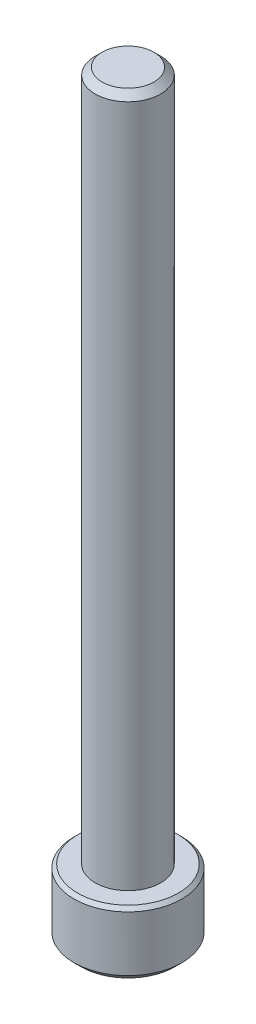
ISO-10303-21;
HEADER;
FILE_DESCRIPTION(('STEP AP214'),'2;1');
FILE_NAME('part.step','',(''),(''),'','','');
FILE_SCHEMA(('AUTOMOTIVE_DESIGN { 1 0 10303 214 1 1 1 1 }'));
ENDSEC;
DATA;
#1=APPLICATION_CONTEXT('core data for automotive mechanical design processes');
#2=APPLICATION_PROTOCOL_DEFINITION('international standard','automotive_design',2000,#1);
#3=PRODUCT_CONTEXT('',#1,'mechanical');
#4=PRODUCT('Part','Part','',(#3));
#5=PRODUCT_RELATED_PRODUCT_CATEGORY('part','',(#4));
#6=PRODUCT_DEFINITION_FORMATION('','',#4);
#7=PRODUCT_DEFINITION_CONTEXT('part definition',#1,'design');
#8=PRODUCT_DEFINITION('design','',#6,#7);
#9=PRODUCT_DEFINITION_SHAPE('','',#8);
#10=(LENGTH_UNIT() NAMED_UNIT(*) SI_UNIT(.MILLI.,.METRE.));
#11=(NAMED_UNIT(*) PLANE_ANGLE_UNIT() SI_UNIT($,.RADIAN.));
#12=(NAMED_UNIT(*) SI_UNIT($,.STERADIAN.) SOLID_ANGLE_UNIT());
#13=UNCERTAINTY_MEASURE_WITH_UNIT(LENGTH_MEASURE(1.E-05),#10,'distance_accuracy_value','');
#14=(GEOMETRIC_REPRESENTATION_CONTEXT(3) GLOBAL_UNCERTAINTY_ASSIGNED_CONTEXT((#13)) GLOBAL_UNIT_ASSIGNED_CONTEXT((#10,
#11,#12)) REPRESENTATION_CONTEXT('',''));
#15=CARTESIAN_POINT('',(0.,0.,0.));
#16=DIRECTION('',(0.,0.,1.));
#17=DIRECTION('',(1.,0.,0.));
#18=AXIS2_PLACEMENT_3D('',#15,#16,#17);
#19=CARTESIAN_POINT('',(0.,-1.8494248,0.));
#20=DIRECTION('',(0.,-1.,0.));
#21=DIRECTION('',(0.,0.,-1.));
#22=AXIS2_PLACEMENT_3D('',#19,#20,#21);
#23=PLANE('',#22);
#24=DIRECTION('',(-0.866025403784439,0.,0.5));
#25=VECTOR('',#24,1.);
#26=CARTESIAN_POINT('',(-1.984375,-1.8494248,-1.14567944042316));
#27=LINE('',#26,#25);
#28=CARTESIAN_POINT('',(-1.984375,-1.8494248,-1.14567944042316));
#29=VERTEX_POINT('',#28);
#30=CARTESIAN_POINT('',(0.,-1.8494248,-2.29135888084633));
#31=VERTEX_POINT('',#30);
#32=EDGE_CURVE('E85',#29,#31,#27,.F.);
#33=ORIENTED_EDGE('',*,*,#32,.T.);
#34=DIRECTION('',(-0.866025403784439,0.,-0.5));
#35=VECTOR('',#34,1.);
#36=CARTESIAN_POINT('',(0.,-1.8494248,-2.29135888084633));
#37=LINE('',#36,#35);
#38=CARTESIAN_POINT('',(1.984375,-1.8494248,-1.14567944042316));
#39=VERTEX_POINT('',#38);
#40=EDGE_CURVE('E86',#31,#39,#37,.F.);
#41=ORIENTED_EDGE('',*,*,#40,.T.);
#42=DIRECTION('',(0.,0.,-1.));
#43=VECTOR('',#42,1.);
#44=CARTESIAN_POINT('',(1.984375,-1.8494248,-1.14567944042316));
#45=LINE('',#44,#43);
#46=CARTESIAN_POINT('',(1.984375,-1.8494248,1.14567944042316));
#47=VERTEX_POINT('',#46);
#48=EDGE_CURVE('E72',#39,#47,#45,.F.);
#49=ORIENTED_EDGE('',*,*,#48,.T.);
#50=DIRECTION('',(0.866025403784438,0.,-0.500000000000001));
#51=VECTOR('',#50,1.);
#52=CARTESIAN_POINT('',(1.984375,-1.8494248,1.14567944042316));
#53=LINE('',#52,#51);
#54=CARTESIAN_POINT('',(0.,-1.8494248,2.29135888084633));
#55=VERTEX_POINT('',#54);
#56=EDGE_CURVE('E111',#47,#55,#53,.F.);
#57=ORIENTED_EDGE('',*,*,#56,.T.);
#58=DIRECTION('',(0.866025403784439,0.,0.5));
#59=VECTOR('',#58,1.);
#60=CARTESIAN_POINT('',(0.,-1.8494248,2.29135888084633));
#61=LINE('',#60,#59);
#62=CARTESIAN_POINT('',(-1.984375,-1.8494248,1.14567944042316));
#63=VERTEX_POINT('',#62);
#64=EDGE_CURVE('E116',#55,#63,#61,.F.);
#65=ORIENTED_EDGE('',*,*,#64,.T.);
#66=DIRECTION('',(0.,0.,1.));
#67=VECTOR('',#66,1.);
#68=CARTESIAN_POINT('',(-1.984375,-1.8494248,1.14567944042316));
#69=LINE('',#68,#67);
#70=EDGE_CURVE('E83',#63,#29,#69,.F.);
#71=ORIENTED_EDGE('',*,*,#70,.T.);
#72=EDGE_LOOP('',(#33,#41,#49,#57,#65,#71));
#73=FACE_BOUND('',#72,.T.);
#74=ADVANCED_FACE('F17',(#73),#23,.T.);
#75=CARTESIAN_POINT('',(0.,-1.8494248,-2.29135888084633));
#76=DIRECTION('',(0.5,0.,-0.866025403784439));
#77=DIRECTION('',(-0.866025403784439,0.,-0.5));
#78=AXIS2_PLACEMENT_3D('',#75,#76,#77);
#79=PLANE('',#78);
#80=CARTESIAN_POINT('',(6.77390980870158E-12,-4.82599999999733,-2.29135888084242));
#81=CARTESIAN_POINT('',(0.0682039378801892,-4.78666022797152,-2.25198131895141));
#82=CARTESIAN_POINT('',(0.137548246994805,-4.74963132848448,-2.21194536341732));
#83=CARTESIAN_POINT('',(0.278948409548869,-4.6818329942972,-2.13030794150327));
#84=CARTESIAN_POINT('',(0.351017702803339,-4.65110127024125,-2.0886987156425));
#85=CARTESIAN_POINT('',(0.496341897584324,-4.59845762015676,-2.00479575266593));
#86=CARTESIAN_POINT('',(0.569559809368178,-4.57641341201181,-1.96252337158802));
#87=CARTESIAN_POINT('',(0.717607077473199,-4.54245011072935,-1.8770482414948));
#88=CARTESIAN_POINT('',(0.7924319144146,-4.53050567477546,-1.83384810174461));
#89=CARTESIAN_POINT('',(0.921395967955599,-4.51972842758016,-1.75939067071693));
#90=CARTESIAN_POINT('',(0.975368691596877,-4.51813352800511,-1.72822950419374));
#91=CARTESIAN_POINT('',(1.08322583079261,-4.52082392144325,-1.66595815584506));
#92=CARTESIAN_POINT('',(1.1371102087676,-4.52511127551635,-1.63484799571608));
#93=CARTESIAN_POINT('',(1.24437007981747,-4.53932219427335,-1.57292148029219));
#94=CARTESIAN_POINT('',(1.29774493597746,-4.54925206051542,-1.54210549272027));
#95=CARTESIAN_POINT('',(1.40357163687848,-4.57420294850528,-1.48100641846761));
#96=CARTESIAN_POINT('',(1.4560235520826,-4.58922357980262,-1.450723291105));
#97=CARTESIAN_POINT('',(1.5903440841042,-4.63380478906143,-1.37317329578464));
#98=CARTESIAN_POINT('',(1.67138069095165,-4.66672213389562,-1.32638678900705));
#99=CARTESIAN_POINT('',(1.79053879220806,-4.72228952043972,-1.25759082717053));
#100=CARTESIAN_POINT('',(1.82980683299605,-4.74181309380753,-1.23491941325104));
#101=CARTESIAN_POINT('',(1.90761582760645,-4.78263970070438,-1.18999636926735));
#102=CARTESIAN_POINT('',(1.94615720952052,-4.80394164367431,-1.16774449204432));
#103=CARTESIAN_POINT('',(1.98437499999323,-4.82599999999733,-1.14567944042707));
#104=B_SPLINE_CURVE_WITH_KNOTS('',3,(#80,#81,#82,#83,#84,#85,#86,#87,#88,#89,#90,#91,#92,#93,
#94,#95,#96,#97,#98,#99,#100,#101,#102,#103),.UNSPECIFIED.,.F.,.F.,(4,2,2,2,2,2,2,2,2,2,2,4),
(0.,0.264284909619185,0.530108996343387,0.791712695392495,1.05265800171552,1.23942150113838,
1.42625045660981,1.61328847391305,1.80031214905772,2.09727151177706,2.24534838939838,
2.39333511883578),.UNSPECIFIED.);
#105=CARTESIAN_POINT('',(0.,-4.82599999999063,-2.29135888083571));
#106=VERTEX_POINT('',#105);
#107=CARTESIAN_POINT('',(1.98437499999661,-4.82599999998867,-1.14567944040389));
#108=VERTEX_POINT('',#107);
#109=EDGE_CURVE('E20',#106,#108,#104,.T.);
#110=ORIENTED_EDGE('',*,*,#109,.T.);
#111=DIRECTION('',(0.,1.,0.));
#112=VECTOR('',#111,1.);
#113=CARTESIAN_POINT('',(1.984375,-1.8494248,-1.14567944042316));
#114=LINE('',#113,#112);
#115=EDGE_CURVE('E91',#108,#39,#114,.T.);
#116=ORIENTED_EDGE('',*,*,#115,.T.);
#117=ORIENTED_EDGE('',*,*,#40,.F.);
#118=DIRECTION('',(0.,1.,0.));
#119=VECTOR('',#118,1.);
#120=CARTESIAN_POINT('',(0.,-1.8494248,-2.29135888084633));
#121=LINE('',#120,#119);
#122=EDGE_CURVE('E59',#31,#106,#121,.F.);
#123=ORIENTED_EDGE('',*,*,#122,.T.);
#124=EDGE_LOOP('',(#110,#116,#117,#123));
#125=FACE_BOUND('',#124,.T.);
#126=ADVANCED_FACE('F90',(#125),#79,.F.);
#127=CARTESIAN_POINT('',(-1.984375,-1.8494248,-1.14567944042316));
#128=DIRECTION('',(-0.5,0.,-0.866025403784439));
#129=DIRECTION('',(-0.866025403784439,0.,0.5));
#130=AXIS2_PLACEMENT_3D('',#127,#128,#129);
#131=PLANE('',#130);
#132=CARTESIAN_POINT('',(-1.98437499999323,-4.82599999999733,-1.14567944042707));
#133=CARTESIAN_POINT('',(-1.91617106211981,-4.78666022797152,-1.18505700231808));
#134=CARTESIAN_POINT('',(-1.84682675300519,-4.74963132848448,-1.22509295785218));
#135=CARTESIAN_POINT('',(-1.70542659045113,-4.6818329942972,-1.30673037976622));
#136=CARTESIAN_POINT('',(-1.63335729719666,-4.65110127024125,-1.348339605627));
#137=CARTESIAN_POINT('',(-1.48803310241568,-4.59845762015676,-1.43224256860356));
#138=CARTESIAN_POINT('',(-1.41481519063182,-4.57641341201181,-1.47451494968147));
#139=CARTESIAN_POINT('',(-1.2667679225268,-4.54245011072935,-1.5599900797747));
#140=CARTESIAN_POINT('',(-1.1919430855854,-4.53050567477546,-1.60319021952488));
#141=CARTESIAN_POINT('',(-1.0629790320444,-4.51972842758016,-1.67764765055256));
#142=CARTESIAN_POINT('',(-1.00900630840312,-4.51813352800511,-1.70880881707575));
#143=CARTESIAN_POINT('',(-0.90114916920739,-4.52082392144325,-1.77108016542443));
#144=CARTESIAN_POINT('',(-0.847264791232404,-4.52511127551635,-1.80219032555341));
#145=CARTESIAN_POINT('',(-0.74000492018253,-4.53932219427335,-1.8641168409773));
#146=CARTESIAN_POINT('',(-0.686630064022541,-4.54925206051542,-1.89493282854922));
#147=CARTESIAN_POINT('',(-0.580803363121521,-4.57420294850528,-1.95603190280188));
#148=CARTESIAN_POINT('',(-0.528351447917403,-4.58922357980262,-1.98631503016449));
#149=CARTESIAN_POINT('',(-0.394030915895799,-4.63380478906143,-2.06386502548485));
#150=CARTESIAN_POINT('',(-0.312994309048352,-4.66672213389562,-2.11065153226244));
#151=CARTESIAN_POINT('',(-0.193836207791939,-4.72228952043972,-2.17944749409896));
#152=CARTESIAN_POINT('',(-0.15456816700395,-4.74181309380753,-2.20211890801845));
#153=CARTESIAN_POINT('',(-0.0767591723935507,-4.78263970070438,-2.24704195200214));
#154=CARTESIAN_POINT('',(-0.0382177904794774,-4.80394164367431,-2.26929382922517));
#155=CARTESIAN_POINT('',(-6.77500264921437E-12,-4.82599999999733,-2.29135888084242));
#156=B_SPLINE_CURVE_WITH_KNOTS('',3,(#132,#133,#134,#135,#136,#137,#138,#139,#140,#141,#142,
#143,#144,#145,#146,#147,#148,#149,#150,#151,#152,#153,#154,#155),.UNSPECIFIED.,.F.,.F.,(4,2,2,
2,2,2,2,2,2,2,2,4),(0.,0.264284909619185,0.530108996343387,0.791712695392495,1.05265800171552,
1.23942150113838,1.42625045660981,1.61328847391305,1.80031214905772,2.09727151177706,
2.24534838939838,2.39333511883578),.UNSPECIFIED.);
#157=CARTESIAN_POINT('',(-1.98437499999081,-4.82599999999063,-1.14567944041786));
#158=VERTEX_POINT('',#157);
#159=EDGE_CURVE('E95',#158,#106,#156,.T.);
#160=ORIENTED_EDGE('',*,*,#159,.T.);
#161=ORIENTED_EDGE('',*,*,#122,.F.);
#162=ORIENTED_EDGE('',*,*,#32,.F.);
#163=DIRECTION('',(0.,1.,0.));
#164=VECTOR('',#163,1.);
#165=CARTESIAN_POINT('',(-1.984375,-1.8494248,-1.14567944042316));
#166=LINE('',#165,#164);
#167=EDGE_CURVE('E97',#29,#158,#166,.F.);
#168=ORIENTED_EDGE('',*,*,#167,.T.);
#169=EDGE_LOOP('',(#160,#161,#162,#168));
#170=FACE_BOUND('',#169,.T.);
#171=ADVANCED_FACE('F93',(#170),#131,.F.);
#172=CARTESIAN_POINT('',(-1.984375,-1.8494248,1.14567944042316));
#173=DIRECTION('',(-1.,0.,0.));
#174=DIRECTION('',(0.,0.,1.));
#175=AXIS2_PLACEMENT_3D('',#172,#173,#174);
#176=PLANE('',#175);
#177=CARTESIAN_POINT('',(-1.984375,-4.82599999999733,1.14567944041534));
#178=CARTESIAN_POINT('',(-1.984375,-4.78666022797249,1.06692431662081));
#179=CARTESIAN_POINT('',(-1.984375,-4.74963132848694,0.986852405540027));
#180=CARTESIAN_POINT('',(-1.984375,-4.68183299430402,0.823577561686758));
#181=CARTESIAN_POINT('',(-1.984375,-4.65110127025095,0.740359109952628));
#182=CARTESIAN_POINT('',(-1.984375,-4.59845762017392,0.572553183974996));
#183=CARTESIAN_POINT('',(-1.984375,-4.5764134120335,0.488008421807264));
#184=CARTESIAN_POINT('',(-1.984375,-4.54245011076168,0.317058161597606));
#185=CARTESIAN_POINT('',(-1.984375,-4.53050567481389,0.230657882085925));
#186=CARTESIAN_POINT('',(-1.984375,-4.51972842762944,0.0817430200043619));
#187=CARTESIAN_POINT('',(-1.984375,-4.51813352805958,0.0194206869428192));
#188=CARTESIAN_POINT('',(-1.984375,-4.52082392150979,-0.105122009784304));
#189=CARTESIAN_POINT('',(-1.984375,-4.52511127558976,-0.167342330056852));
#190=CARTESIAN_POINT('',(-1.984375,-4.53932219436172,-0.291195360933165));
#191=CARTESIAN_POINT('',(-1.984375,-4.54925206061188,-0.352827336090956));
#192=CARTESIAN_POINT('',(-1.984375,-4.57420294861864,-0.475025484623506));
#193=CARTESIAN_POINT('',(-1.984375,-4.58922357992478,-0.535591739362032));
#194=CARTESIAN_POINT('',(-1.984375,-4.63380478918439,-0.690691729958718));
#195=CARTESIAN_POINT('',(-1.984375,-4.66672213400171,-0.784264743458756));
#196=CARTESIAN_POINT('',(-1.984375,-4.72228952051173,-0.92185666705287));
#197=CARTESIAN_POINT('',(-1.984375,-4.74181309386669,-0.967199494866103));
#198=CARTESIAN_POINT('',(-1.984375,-4.78263970073555,-1.05704558278325));
#199=CARTESIAN_POINT('',(-1.984375,-4.80394164369034,-1.10154933720483));
#200=CARTESIAN_POINT('',(-1.984375,-4.82599999999733,-1.14567944041534));
#201=B_SPLINE_CURVE_WITH_KNOTS('',3,(#177,#178,#179,#180,#181,#182,#183,#184,#185,#186,#187,
#188,#189,#190,#191,#192,#193,#194,#195,#196,#197,#198,#199,#200),.UNSPECIFIED.,.F.,.F.,(4,2,2,
2,2,2,2,2,2,2,2,4),(0.,0.264284909651518,0.530108996408062,0.791712695488213,1.05265800184225,
1.23942150131009,1.42625045682656,1.6132884741749,1.80031214936466,2.09727151191273,
2.24534838944787,2.39333511879948),.UNSPECIFIED.);
#202=CARTESIAN_POINT('',(-1.98437499999081,-4.82599999999063,1.14567944041786));
#203=VERTEX_POINT('',#202);
#204=EDGE_CURVE('E199',#203,#158,#201,.T.);
#205=ORIENTED_EDGE('',*,*,#204,.T.);
#206=ORIENTED_EDGE('',*,*,#167,.F.);
#207=ORIENTED_EDGE('',*,*,#70,.F.);
#208=DIRECTION('',(0.,1.,0.));
#209=VECTOR('',#208,1.);
#210=CARTESIAN_POINT('',(-1.984375,-1.8494248,1.14567944042316));
#211=LINE('',#210,#209);
#212=EDGE_CURVE('E113',#63,#203,#211,.F.);
#213=ORIENTED_EDGE('',*,*,#212,.T.);
#214=EDGE_LOOP('',(#205,#206,#207,#213));
#215=FACE_BOUND('',#214,.T.);
#216=ADVANCED_FACE('F209',(#215),#176,.F.);
#217=CARTESIAN_POINT('',(0.,-1.8494248,2.29135888084633));
#218=DIRECTION('',(-0.5,0.,0.866025403784439));
#219=DIRECTION('',(0.866025403784439,0.,0.5));
#220=AXIS2_PLACEMENT_3D('',#217,#218,#219);
#221=PLANE('',#220);
#222=CARTESIAN_POINT('',(-6.77280332076929E-12,-4.82599999999733,2.29135888084242));
#223=CARTESIAN_POINT('',(-0.0682039378801884,-4.78666022797152,2.25198131895141));
#224=CARTESIAN_POINT('',(-0.137548246994804,-4.74963132848448,2.21194536341732));
#225=CARTESIAN_POINT('',(-0.278948409548868,-4.6818329942972,2.13030794150327));
#226=CARTESIAN_POINT('',(-0.351017702803339,-4.65110127024125,2.0886987156425));
#227=CARTESIAN_POINT('',(-0.496341897584323,-4.59845762015676,2.00479575266593));
#228=CARTESIAN_POINT('',(-0.569559809368178,-4.57641341201181,1.96252337158802));
#229=CARTESIAN_POINT('',(-0.717607077473198,-4.54245011072935,1.8770482414948));
#230=CARTESIAN_POINT('',(-0.7924319144146,-4.53050567477546,1.83384810174461));
#231=CARTESIAN_POINT('',(-0.921395967955599,-4.51972842758016,1.75939067071693));
#232=CARTESIAN_POINT('',(-0.975368691596876,-4.51813352800511,1.72822950419374));
#233=CARTESIAN_POINT('',(-1.08322583079261,-4.52082392144325,1.66595815584506));
#234=CARTESIAN_POINT('',(-1.1371102087676,-4.52511127551635,1.63484799571608));
#235=CARTESIAN_POINT('',(-1.24437007981747,-4.53932219427335,1.57292148029219));
#236=CARTESIAN_POINT('',(-1.29774493597746,-4.54925206051542,1.54210549272027));
#237=CARTESIAN_POINT('',(-1.40357163687848,-4.57420294850528,1.48100641846761));
#238=CARTESIAN_POINT('',(-1.4560235520826,-4.58922357980262,1.450723291105));
#239=CARTESIAN_POINT('',(-1.5903440841042,-4.63380478906143,1.37317329578464));
#240=CARTESIAN_POINT('',(-1.67138069095165,-4.66672213389562,1.32638678900705));
#241=CARTESIAN_POINT('',(-1.79053879220806,-4.72228952043972,1.25759082717054));
#242=CARTESIAN_POINT('',(-1.82980683299605,-4.74181309380753,1.23491941325104));
#243=CARTESIAN_POINT('',(-1.90761582760645,-4.78263970070438,1.18999636926735));
#244=CARTESIAN_POINT('',(-1.94615720952052,-4.80394164367431,1.16774449204432));
#245=CARTESIAN_POINT('',(-1.98437499999322,-4.82599999999733,1.14567944042707));
#246=B_SPLINE_CURVE_WITH_KNOTS('',3,(#222,#223,#224,#225,#226,#227,#228,#229,#230,#231,#232,
#233,#234,#235,#236,#237,#238,#239,#240,#241,#242,#243,#244,#245),.UNSPECIFIED.,.F.,.F.,(4,2,2,
2,2,2,2,2,2,2,2,4),(0.,0.264284909619185,0.530108996343387,0.791712695392495,1.05265800171552,
1.23942150113838,1.42625045660981,1.61328847391305,1.80031214905773,2.09727151177706,
2.24534838939838,2.39333511883578),.UNSPECIFIED.);
#247=CARTESIAN_POINT('',(0.,-4.82599999999063,2.29135888083571));
#248=VERTEX_POINT('',#247);
#249=EDGE_CURVE('E191',#248,#203,#246,.T.);
#250=ORIENTED_EDGE('',*,*,#249,.T.);
#251=ORIENTED_EDGE('',*,*,#212,.F.);
#252=ORIENTED_EDGE('',*,*,#64,.F.);
#253=DIRECTION('',(0.,1.,0.));
#254=VECTOR('',#253,1.);
#255=CARTESIAN_POINT('',(0.,-1.8494248,2.29135888084633));
#256=LINE('',#255,#254);
#257=EDGE_CURVE('E108',#55,#248,#256,.F.);
#258=ORIENTED_EDGE('',*,*,#257,.T.);
#259=EDGE_LOOP('',(#250,#251,#252,#258));
#260=FACE_BOUND('',#259,.T.);
#261=ADVANCED_FACE('F205',(#260),#221,.F.);
#262=CARTESIAN_POINT('',(1.984375,-1.8494248,1.14567944042316));
#263=DIRECTION('',(0.500000000000001,0.,0.866025403784438));
#264=DIRECTION('',(0.866025403784438,0.,-0.500000000000001));
#265=AXIS2_PLACEMENT_3D('',#262,#263,#264);
#266=PLANE('',#265);
#267=CARTESIAN_POINT('',(1.98437499999322,-4.82599999999733,1.14567944042707));
#268=CARTESIAN_POINT('',(1.91617106211981,-4.78666022797152,1.18505700231808));
#269=CARTESIAN_POINT('',(1.84682675300519,-4.74963132848448,1.22509295785218));
#270=CARTESIAN_POINT('',(1.70542659045113,-4.6818329942972,1.30673037976622));
#271=CARTESIAN_POINT('',(1.63335729719666,-4.65110127024125,1.348339605627));
#272=CARTESIAN_POINT('',(1.48803310241568,-4.59845762015676,1.43224256860356));
#273=CARTESIAN_POINT('',(1.41481519063182,-4.57641341201181,1.47451494968147));
#274=CARTESIAN_POINT('',(1.2667679225268,-4.54245011072935,1.5599900797747));
#275=CARTESIAN_POINT('',(1.1919430855854,-4.53050567477546,1.60319021952488));
#276=CARTESIAN_POINT('',(1.0629790320444,-4.51972842758016,1.67764765055256));
#277=CARTESIAN_POINT('',(1.00900630840312,-4.51813352800511,1.70880881707575));
#278=CARTESIAN_POINT('',(0.901149169207391,-4.52082392144325,1.77108016542443));
#279=CARTESIAN_POINT('',(0.847264791232404,-4.52511127551635,1.80219032555341));
#280=CARTESIAN_POINT('',(0.740004920182531,-4.53932219427335,1.8641168409773));
#281=CARTESIAN_POINT('',(0.686630064022542,-4.54925206051542,1.89493282854922));
#282=CARTESIAN_POINT('',(0.580803363121522,-4.57420294850528,1.95603190280188));
#283=CARTESIAN_POINT('',(0.528351447917404,-4.58922357980262,1.98631503016449));
#284=CARTESIAN_POINT('',(0.3940309158958,-4.63380478906143,2.06386502548485));
#285=CARTESIAN_POINT('',(0.312994309048353,-4.66672213389562,2.11065153226244));
#286=CARTESIAN_POINT('',(0.19383620779194,-4.72228952043972,2.17944749409896));
#287=CARTESIAN_POINT('',(0.154568167003951,-4.74181309380753,2.20211890801845));
#288=CARTESIAN_POINT('',(0.0767591723935514,-4.78263970070438,2.24704195200214));
#289=CARTESIAN_POINT('',(0.0382177904794783,-4.80394164367431,2.26929382922517));
#290=CARTESIAN_POINT('',(6.77665822476954E-12,-4.82599999999733,2.29135888084242));
#291=B_SPLINE_CURVE_WITH_KNOTS('',3,(#267,#268,#269,#270,#271,#272,#273,#274,#275,#276,#277,
#278,#279,#280,#281,#282,#283,#284,#285,#286,#287,#288,#289,#290),.UNSPECIFIED.,.F.,.F.,(4,2,2,
2,2,2,2,2,2,2,2,4),(0.,0.264284909619184,0.530108996343386,0.791712695392493,1.05265800171551,
1.23942150113838,1.42625045660981,1.61328847391304,1.80031214905772,2.09727151177706,
2.24534838939837,2.39333511883578),.UNSPECIFIED.);
#292=CARTESIAN_POINT('',(1.98437499999081,-4.82599999999063,1.14567944041786));
#293=VERTEX_POINT('',#292);
#294=EDGE_CURVE('E161',#293,#248,#291,.T.);
#295=ORIENTED_EDGE('',*,*,#294,.T.);
#296=ORIENTED_EDGE('',*,*,#257,.F.);
#297=ORIENTED_EDGE('',*,*,#56,.F.);
#298=DIRECTION('',(0.,1.,0.));
#299=VECTOR('',#298,1.);
#300=CARTESIAN_POINT('',(1.984375,-1.8494248,1.14567944042316));
#301=LINE('',#300,#299);
#302=EDGE_CURVE('E40',#47,#293,#301,.F.);
#303=ORIENTED_EDGE('',*,*,#302,.T.);
#304=EDGE_LOOP('',(#295,#296,#297,#303));
#305=FACE_BOUND('',#304,.T.);
#306=ADVANCED_FACE('F208',(#305),#266,.F.);
#307=CARTESIAN_POINT('',(1.984375,-1.8494248,-1.14567944042316));
#308=DIRECTION('',(1.,0.,0.));
#309=DIRECTION('',(0.,0.,-1.));
#310=AXIS2_PLACEMENT_3D('',#307,#308,#309);
#311=PLANE('',#310);
#312=CARTESIAN_POINT('',(1.984375,-4.82599999999733,-1.14567944041534));
#313=CARTESIAN_POINT('',(1.984375,-4.78666022797249,-1.0669243166208));
#314=CARTESIAN_POINT('',(1.984375,-4.74963132848694,-0.986852405540026));
#315=CARTESIAN_POINT('',(1.984375,-4.68183299430402,-0.823577561686757));
#316=CARTESIAN_POINT('',(1.984375,-4.65110127025095,-0.740359109952626));
#317=CARTESIAN_POINT('',(1.984375,-4.59845762017392,-0.572553183974995));
#318=CARTESIAN_POINT('',(1.984375,-4.5764134120335,-0.488008421807263));
#319=CARTESIAN_POINT('',(1.984375,-4.54245011076168,-0.317058161597605));
#320=CARTESIAN_POINT('',(1.984375,-4.53050567481389,-0.230657882085925));
#321=CARTESIAN_POINT('',(1.984375,-4.51972842762944,-0.0817430200043615));
#322=CARTESIAN_POINT('',(1.984375,-4.51813352805958,-0.0194206869428188));
#323=CARTESIAN_POINT('',(1.984375,-4.52082392150979,0.105122009784304));
#324=CARTESIAN_POINT('',(1.984375,-4.52511127558976,0.167342330056852));
#325=CARTESIAN_POINT('',(1.984375,-4.53932219436172,0.291195360933165));
#326=CARTESIAN_POINT('',(1.984375,-4.54925206061188,0.352827336090956));
#327=CARTESIAN_POINT('',(1.984375,-4.57420294861864,0.475025484623506));
#328=CARTESIAN_POINT('',(1.984375,-4.58922357992478,0.535591739362032));
#329=CARTESIAN_POINT('',(1.984375,-4.63380478918439,0.690691729958719));
#330=CARTESIAN_POINT('',(1.984375,-4.66672213400171,0.784264743458756));
#331=CARTESIAN_POINT('',(1.984375,-4.72228952051173,0.92185666705287));
#332=CARTESIAN_POINT('',(1.984375,-4.7418130938667,0.967199494866103));
#333=CARTESIAN_POINT('',(1.984375,-4.78263970073555,1.05704558278324));
#334=CARTESIAN_POINT('',(1.984375,-4.80394164369034,1.10154933720483));
#335=CARTESIAN_POINT('',(1.984375,-4.82599999999733,1.14567944041534));
#336=B_SPLINE_CURVE_WITH_KNOTS('',3,(#312,#313,#314,#315,#316,#317,#318,#319,#320,#321,#322,
#323,#324,#325,#326,#327,#328,#329,#330,#331,#332,#333,#334,#335),.UNSPECIFIED.,.F.,.F.,(4,2,2,
2,2,2,2,2,2,2,2,4),(0.,0.264284909651518,0.530108996408063,0.791712695488213,1.05265800184225,
1.23942150131009,1.42625045682656,1.6132884741749,1.80031214936466,2.09727151191273,
2.24534838944787,2.39333511879948),.UNSPECIFIED.);
#337=EDGE_CURVE('E153',#108,#293,#336,.T.);
#338=ORIENTED_EDGE('',*,*,#337,.T.);
#339=ORIENTED_EDGE('',*,*,#302,.F.);
#340=ORIENTED_EDGE('',*,*,#48,.F.);
#341=ORIENTED_EDGE('',*,*,#115,.F.);
#342=EDGE_LOOP('',(#338,#339,#340,#341));
#343=FACE_BOUND('',#342,.T.);
#344=ADVANCED_FACE('F169',(#343),#311,.F.);
#345=CARTESIAN_POINT('',(0.,-4.82599999998001,0.));
#346=DIRECTION('',(0.,-1.,0.));
#347=DIRECTION('',(0.,0.,-1.));
#348=AXIS2_PLACEMENT_3D('',#345,#346,#347);
#349=CONICAL_SURFACE('',#348,2.2913588808251,0.785398163397448);
#350=ORIENTED_EDGE('',*,*,#109,.F.);
#351=CARTESIAN_POINT('',(0.,-4.82599999998001,0.));
#352=DIRECTION('',(0.,-1.,0.));
#353=DIRECTION('',(0.,0.,-1.));
#354=AXIS2_PLACEMENT_3D('',#351,#352,#353);
#355=CIRCLE('',#354,2.2913588808251);
#356=EDGE_CURVE('E150',#108,#106,#355,.F.);
#357=ORIENTED_EDGE('',*,*,#356,.F.);
#358=EDGE_LOOP('',(#350,#357));
#359=FACE_BOUND('',#358,.T.);
#360=ADVANCED_FACE('F226',(#359),#349,.F.);
#361=CARTESIAN_POINT('',(0.,-4.82599999998001,0.));
#362=DIRECTION('',(0.,-1.,0.));
#363=DIRECTION('',(0.,0.,-1.));
#364=AXIS2_PLACEMENT_3D('',#361,#362,#363);
#365=CONICAL_SURFACE('',#364,2.2913588808251,0.785398163397448);
#366=ORIENTED_EDGE('',*,*,#159,.F.);
#367=CARTESIAN_POINT('',(0.,-4.82599999998001,0.));
#368=DIRECTION('',(0.,-1.,0.));
#369=DIRECTION('',(0.,0.,-1.));
#370=AXIS2_PLACEMENT_3D('',#367,#368,#369);
#371=CIRCLE('',#370,2.2913588808251);
#372=EDGE_CURVE('E147',#106,#158,#371,.F.);
#373=ORIENTED_EDGE('',*,*,#372,.F.);
#374=EDGE_LOOP('',(#366,#373));
#375=FACE_BOUND('',#374,.T.);
#376=ADVANCED_FACE('F223',(#375),#365,.F.);
#377=CARTESIAN_POINT('',(0.,-4.82599999998001,0.));
#378=DIRECTION('',(0.,-1.,0.));
#379=DIRECTION('',(0.,0.,-1.));
#380=AXIS2_PLACEMENT_3D('',#377,#378,#379);
#381=CONICAL_SURFACE('',#380,2.2913588808251,0.785398163489456);
#382=ORIENTED_EDGE('',*,*,#204,.F.);
#383=CARTESIAN_POINT('',(0.,-4.82599999998001,0.));
#384=DIRECTION('',(0.,-1.,0.));
#385=DIRECTION('',(0.,0.,-1.));
#386=AXIS2_PLACEMENT_3D('',#383,#384,#385);
#387=CIRCLE('',#386,2.2913588808251);
#388=EDGE_CURVE('E144',#158,#203,#387,.F.);
#389=ORIENTED_EDGE('',*,*,#388,.F.);
#390=EDGE_LOOP('',(#382,#389));
#391=FACE_BOUND('',#390,.T.);
#392=ADVANCED_FACE('F187',(#391),#381,.F.);
#393=CARTESIAN_POINT('',(0.,-4.82599999998001,0.));
#394=DIRECTION('',(0.,-1.,0.));
#395=DIRECTION('',(0.,0.,-1.));
#396=AXIS2_PLACEMENT_3D('',#393,#394,#395);
#397=CONICAL_SURFACE('',#396,2.2913588808251,0.785398163397448);
#398=ORIENTED_EDGE('',*,*,#249,.F.);
#399=CARTESIAN_POINT('',(0.,-4.82599999998001,0.));
#400=DIRECTION('',(0.,-1.,0.));
#401=DIRECTION('',(0.,0.,-1.));
#402=AXIS2_PLACEMENT_3D('',#399,#400,#401);
#403=CIRCLE('',#402,2.2913588808251);
#404=EDGE_CURVE('E141',#203,#248,#403,.F.);
#405=ORIENTED_EDGE('',*,*,#404,.F.);
#406=EDGE_LOOP('',(#398,#405));
#407=FACE_BOUND('',#406,.T.);
#408=ADVANCED_FACE('F182',(#407),#397,.F.);
#409=CARTESIAN_POINT('',(0.,-4.82599999998001,0.));
#410=DIRECTION('',(0.,-1.,0.));
#411=DIRECTION('',(0.,0.,-1.));
#412=AXIS2_PLACEMENT_3D('',#409,#410,#411);
#413=CONICAL_SURFACE('',#412,2.2913588808251,0.785398163397448);
#414=ORIENTED_EDGE('',*,*,#294,.F.);
#415=CARTESIAN_POINT('',(0.,-4.82599999998001,0.));
#416=DIRECTION('',(0.,-1.,0.));
#417=DIRECTION('',(0.,0.,-1.));
#418=AXIS2_PLACEMENT_3D('',#415,#416,#417);
#419=CIRCLE('',#418,2.2913588808251);
#420=EDGE_CURVE('E138',#248,#293,#419,.F.);
#421=ORIENTED_EDGE('',*,*,#420,.F.);
#422=EDGE_LOOP('',(#414,#421));
#423=FACE_BOUND('',#422,.T.);
#424=ADVANCED_FACE('F176',(#423),#413,.F.);
#425=CARTESIAN_POINT('',(0.,-4.82599999998001,0.));
#426=DIRECTION('',(0.,-1.,0.));
#427=DIRECTION('',(0.,0.,-1.));
#428=AXIS2_PLACEMENT_3D('',#425,#426,#427);
#429=CONICAL_SURFACE('',#428,2.2913588808251,0.785398163489456);
#430=ORIENTED_EDGE('',*,*,#337,.F.);
#431=CARTESIAN_POINT('',(0.,-4.82599999998001,0.));
#432=DIRECTION('',(0.,-1.,0.));
#433=DIRECTION('',(0.,0.,-1.));
#434=AXIS2_PLACEMENT_3D('',#431,#432,#433);
#435=CIRCLE('',#434,2.2913588808251);
#436=EDGE_CURVE('E135',#293,#108,#435,.F.);
#437=ORIENTED_EDGE('',*,*,#436,.F.);
#438=EDGE_LOOP('',(#430,#437));
#439=FACE_BOUND('',#438,.T.);
#440=ADVANCED_FACE('F171',(#439),#429,.F.);
#441=CARTESIAN_POINT('',(0.,-4.826,0.));
#442=DIRECTION('',(0.,-1.,0.));
#443=DIRECTION('',(0.,0.,-1.));
#444=AXIS2_PLACEMENT_3D('',#441,#442,#443);
#445=PLANE('',#444);
#446=ORIENTED_EDGE('',*,*,#420,.T.);
#447=ORIENTED_EDGE('',*,*,#436,.T.);
#448=ORIENTED_EDGE('',*,*,#356,.T.);
#449=ORIENTED_EDGE('',*,*,#372,.T.);
#450=ORIENTED_EDGE('',*,*,#388,.T.);
#451=ORIENTED_EDGE('',*,*,#404,.T.);
#452=EDGE_LOOP('',(#446,#447,#448,#449,#450,#451));
#453=FACE_BOUND('',#452,.T.);
#454=CARTESIAN_POINT('',(0.,-4.82599999998001,0.));
#455=DIRECTION('',(0.,1.,0.));
#456=DIRECTION('',(0.,0.,1.));
#457=AXIS2_PLACEMENT_3D('',#454,#455,#456);
#458=CIRCLE('',#457,3.46074999998791);
#459=CARTESIAN_POINT('',(0.,-4.82599999998001,3.46074999998791));
#460=VERTEX_POINT('',#459);
#461=EDGE_CURVE('E131',#460,#460,#458,.T.);
#462=ORIENTED_EDGE('',*,*,#461,.F.);
#463=EDGE_LOOP('',(#462));
#464=FACE_BOUND('',#463,.T.);
#465=ADVANCED_FACE('F175',(#453,#464),#445,.T.);
#466=CARTESIAN_POINT('',(0.,-4.31800000001203,0.));
#467=DIRECTION('',(0.,1.,0.));
#468=DIRECTION('',(0.,0.,1.));
#469=AXIS2_PLACEMENT_3D('',#466,#467,#468);
#470=CONICAL_SURFACE('',#469,3.96875000001273,0.785398163453397);
#471=ORIENTED_EDGE('',*,*,#461,.T.);
#472=EDGE_LOOP('',(#471));
#473=FACE_BOUND('',#472,.T.);
#474=CARTESIAN_POINT('',(0.,-4.318,0.));
#475=DIRECTION('',(0.,1.,0.));
#476=DIRECTION('',(0.,0.,1.));
#477=AXIS2_PLACEMENT_3D('',#474,#475,#476);
#478=CIRCLE('',#477,3.96875);
#479=CARTESIAN_POINT('',(0.,-4.318,3.96875));
#480=VERTEX_POINT('',#479);
#481=EDGE_CURVE('E134',#480,#480,#478,.T.);
#482=ORIENTED_EDGE('',*,*,#481,.F.);
#483=EDGE_LOOP('',(#482));
#484=FACE_BOUND('',#483,.T.);
#485=ADVANCED_FACE('F262',(#473,#484),#470,.T.);
#486=CARTESIAN_POINT('',(0.,-4.826,0.));
#487=DIRECTION('',(0.,1.,0.));
#488=DIRECTION('',(0.,0.,1.));
#489=AXIS2_PLACEMENT_3D('',#486,#487,#488);
#490=CYLINDRICAL_SURFACE('',#489,3.96875);
#491=ORIENTED_EDGE('',*,*,#481,.T.);
#492=EDGE_LOOP('',(#491));
#493=FACE_BOUND('',#492,.T.);
#494=CARTESIAN_POINT('',(0.,-0.253999999983989,0.));
#495=DIRECTION('',(0.,-1.,0.));
#496=DIRECTION('',(0.,0.,-1.));
#497=AXIS2_PLACEMENT_3D('',#494,#495,#496);
#498=CIRCLE('',#497,3.96875000001273);
#499=CARTESIAN_POINT('',(0.,-0.253999999983989,-3.96875000001273));
#500=VERTEX_POINT('',#499);
#501=EDGE_CURVE('E130',#500,#500,#498,.F.);
#502=ORIENTED_EDGE('',*,*,#501,.F.);
#503=EDGE_LOOP('',(#502));
#504=FACE_BOUND('',#503,.T.);
#505=ADVANCED_FACE('F259',(#493,#504),#490,.T.);
#506=CARTESIAN_POINT('',(0.,50.8,0.));
#507=DIRECTION('',(0.,1.,0.));
#508=DIRECTION('',(0.,0.,1.));
#509=AXIS2_PLACEMENT_3D('',#506,#507,#508);
#510=PLANE('',#509);
#511=CARTESIAN_POINT('',(0.,50.7999999999242,0.));
#512=DIRECTION('',(0.,-1.,0.));
#513=DIRECTION('',(0.,0.,-1.));
#514=AXIS2_PLACEMENT_3D('',#511,#512,#513);
#515=CIRCLE('',#514,1.90499999996518);
#516=CARTESIAN_POINT('',(0.,50.7999999999242,-1.90499999996518));
#517=VERTEX_POINT('',#516);
#518=EDGE_CURVE('E127',#517,#517,#515,.T.);
#519=ORIENTED_EDGE('',*,*,#518,.F.);
#520=EDGE_LOOP('',(#519));
#521=FACE_BOUND('',#520,.T.);
#522=ADVANCED_FACE('F255',(#521),#510,.T.);
#523=CARTESIAN_POINT('',(0.,-0.253999999870302,0.));
#524=DIRECTION('',(0.,-1.,0.));
#525=DIRECTION('',(0.,0.,-1.));
#526=AXIS2_PLACEMENT_3D('',#523,#524,#525);
#527=CONICAL_SURFACE('',#526,3.96874999989905,0.785398163397448);
#528=CARTESIAN_POINT('',(0.,5.6843418860808E-11,0.));
#529=DIRECTION('',(0.,-1.,0.));
#530=DIRECTION('',(0.,0.,-1.));
#531=AXIS2_PLACEMENT_3D('',#528,#529,#530);
#532=CIRCLE('',#531,3.7147499999719);
#533=CARTESIAN_POINT('',(0.,5.6843418860808E-11,-3.7147499999719));
#534=VERTEX_POINT('',#533);
#535=EDGE_CURVE('E124',#534,#534,#532,.T.);
#536=ORIENTED_EDGE('',*,*,#535,.T.);
#537=EDGE_LOOP('',(#536));
#538=FACE_BOUND('',#537,.T.);
#539=ORIENTED_EDGE('',*,*,#501,.T.);
#540=EDGE_LOOP('',(#539));
#541=FACE_BOUND('',#540,.T.);
#542=ADVANCED_FACE('F251',(#538,#541),#527,.T.);
#543=CARTESIAN_POINT('',(0.,50.2920000000699,0.));
#544=DIRECTION('',(0.,-1.,0.));
#545=DIRECTION('',(0.,0.,-1.));
#546=AXIS2_PLACEMENT_3D('',#543,#544,#545);
#547=CONICAL_SURFACE('',#546,2.41299999987632,0.785398163453397);
#548=CARTESIAN_POINT('',(0.,50.292,0.));
#549=DIRECTION('',(0.,-1.,0.));
#550=DIRECTION('',(0.,0.,-1.));
#551=AXIS2_PLACEMENT_3D('',#548,#549,#550);
#552=CIRCLE('',#551,2.413);
#553=CARTESIAN_POINT('',(0.,50.292,-2.413));
#554=VERTEX_POINT('',#553);
#555=EDGE_CURVE('E31',#554,#554,#552,.T.);
#556=ORIENTED_EDGE('',*,*,#555,.F.);
#557=EDGE_LOOP('',(#556));
#558=FACE_BOUND('',#557,.T.);
#559=ORIENTED_EDGE('',*,*,#518,.T.);
#560=EDGE_LOOP('',(#559));
#561=FACE_BOUND('',#560,.T.);
#562=ADVANCED_FACE('F244',(#558,#561),#547,.T.);
#563=CARTESIAN_POINT('',(0.,0.,0.));
#564=DIRECTION('',(0.,-1.,0.));
#565=DIRECTION('',(0.,0.,-1.));
#566=AXIS2_PLACEMENT_3D('',#563,#564,#565);
#567=PLANE('',#566);
#568=CARTESIAN_POINT('',(0.,0.,0.));
#569=DIRECTION('',(0.,-1.,0.));
#570=DIRECTION('',(0.,0.,-1.));
#571=AXIS2_PLACEMENT_3D('',#568,#569,#570);
#572=CIRCLE('',#571,2.413);
#573=CARTESIAN_POINT('',(0.,0.,-2.413));
#574=VERTEX_POINT('',#573);
#575=EDGE_CURVE('E11',#574,#574,#572,.F.);
#576=ORIENTED_EDGE('',*,*,#575,.F.);
#577=EDGE_LOOP('',(#576));
#578=FACE_BOUND('',#577,.T.);
#579=ORIENTED_EDGE('',*,*,#535,.F.);
#580=EDGE_LOOP('',(#579));
#581=FACE_BOUND('',#580,.T.);
#582=ADVANCED_FACE('F238',(#578,#581),#567,.F.);
#583=CARTESIAN_POINT('',(0.,50.8,0.));
#584=DIRECTION('',(0.,-1.,0.));
#585=DIRECTION('',(0.,0.,-1.));
#586=AXIS2_PLACEMENT_3D('',#583,#584,#585);
#587=CYLINDRICAL_SURFACE('',#586,2.413);
#588=ORIENTED_EDGE('',*,*,#575,.T.);
#589=EDGE_LOOP('',(#588));
#590=FACE_BOUND('',#589,.T.);
#591=ORIENTED_EDGE('',*,*,#555,.T.);
#592=EDGE_LOOP('',(#591));
#593=FACE_BOUND('',#592,.T.);
#594=ADVANCED_FACE('F236',(#590,#593),#587,.T.);
#595=CLOSED_SHELL('',(#74,#126,#171,#216,#261,#306,#344,#360,#376,#392,#408,#424,#440,#465,#485,
#505,#522,#542,#562,#582,#594));
#596=MANIFOLD_SOLID_BREP('B1',#595);
#597=ADVANCED_BREP_SHAPE_REPRESENTATION('',(#18,#596),#14);
#598=SHAPE_DEFINITION_REPRESENTATION(#9,#597);
ENDSEC;
END-ISO-10303-21;
